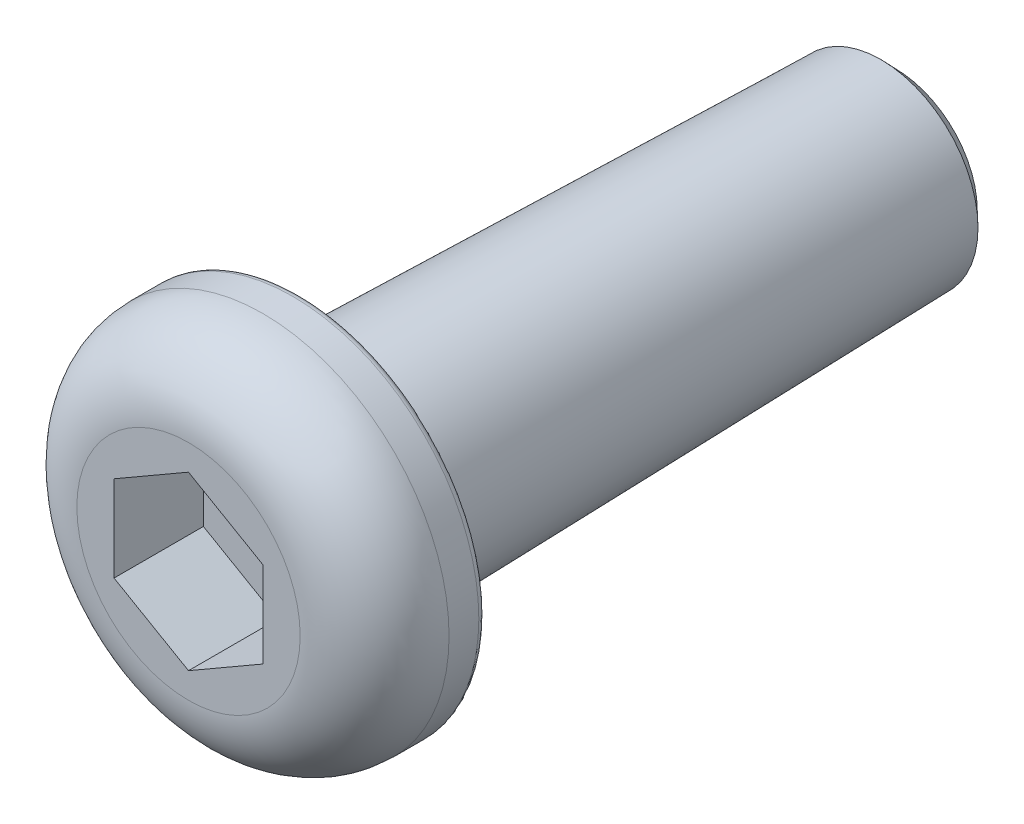
ISO-10303-21;
HEADER;
FILE_DESCRIPTION(('STEP AP214'),'2;1');
FILE_NAME('part.step','',(''),(''),'','','');
FILE_SCHEMA(('AUTOMOTIVE_DESIGN { 1 0 10303 214 1 1 1 1 }'));
ENDSEC;
DATA;
#1=APPLICATION_CONTEXT('core data for automotive mechanical design processes');
#2=APPLICATION_PROTOCOL_DEFINITION('international standard','automotive_design',2000,#1);
#3=PRODUCT_CONTEXT('',#1,'mechanical');
#4=PRODUCT('Part','Part','',(#3));
#5=PRODUCT_RELATED_PRODUCT_CATEGORY('part','',(#4));
#6=PRODUCT_DEFINITION_FORMATION('','',#4);
#7=PRODUCT_DEFINITION_CONTEXT('part definition',#1,'design');
#8=PRODUCT_DEFINITION('design','',#6,#7);
#9=PRODUCT_DEFINITION_SHAPE('','',#8);
#10=(LENGTH_UNIT() NAMED_UNIT(*) SI_UNIT(.MILLI.,.METRE.));
#11=(NAMED_UNIT(*) PLANE_ANGLE_UNIT() SI_UNIT($,.RADIAN.));
#12=(NAMED_UNIT(*) SI_UNIT($,.STERADIAN.) SOLID_ANGLE_UNIT());
#13=UNCERTAINTY_MEASURE_WITH_UNIT(LENGTH_MEASURE(1.E-05),#10,'distance_accuracy_value','');
#14=(GEOMETRIC_REPRESENTATION_CONTEXT(3) GLOBAL_UNCERTAINTY_ASSIGNED_CONTEXT((#13)) GLOBAL_UNIT_ASSIGNED_CONTEXT((#10,
#11,#12)) REPRESENTATION_CONTEXT('',''));
#15=CARTESIAN_POINT('',(0.,0.,0.));
#16=DIRECTION('',(0.,0.,1.));
#17=DIRECTION('',(1.,0.,0.));
#18=AXIS2_PLACEMENT_3D('',#15,#16,#17);
#19=CARTESIAN_POINT('',(0.,0.,8.3));
#20=DIRECTION('',(0.,0.,1.));
#21=DIRECTION('',(1.,0.,0.));
#22=AXIS2_PLACEMENT_3D('',#19,#20,#21);
#23=PLANE('',#22);
#24=DIRECTION('',(0.866025403784439,0.5,0.));
#25=VECTOR('',#24,1.);
#26=CARTESIAN_POINT('',(0.,-1.15470053837925,8.3));
#27=LINE('',#26,#25);
#28=CARTESIAN_POINT('',(0.,-1.15470053837925,8.3));
#29=VERTEX_POINT('',#28);
#30=CARTESIAN_POINT('',(1.,-0.577350269189626,8.3));
#31=VERTEX_POINT('',#30);
#32=EDGE_CURVE('E97',#29,#31,#27,.T.);
#33=ORIENTED_EDGE('',*,*,#32,.T.);
#34=DIRECTION('',(0.,1.,0.));
#35=VECTOR('',#34,1.);
#36=CARTESIAN_POINT('',(1.,-0.577350269189626,8.3));
#37=LINE('',#36,#35);
#38=CARTESIAN_POINT('',(1.,0.577350269189626,8.3));
#39=VERTEX_POINT('',#38);
#40=EDGE_CURVE('E100',#31,#39,#37,.T.);
#41=ORIENTED_EDGE('',*,*,#40,.T.);
#42=DIRECTION('',(-0.866025403784439,0.5,0.));
#43=VECTOR('',#42,1.);
#44=CARTESIAN_POINT('',(0.999999999999999,0.577350269189626,8.3));
#45=LINE('',#44,#43);
#46=CARTESIAN_POINT('',(0.,1.15470053837925,8.3));
#47=VERTEX_POINT('',#46);
#48=EDGE_CURVE('E102',#39,#47,#45,.T.);
#49=ORIENTED_EDGE('',*,*,#48,.T.);
#50=DIRECTION('',(-0.866025403784439,-0.5,0.));
#51=VECTOR('',#50,1.);
#52=CARTESIAN_POINT('',(0.,1.15470053837925,8.3));
#53=LINE('',#52,#51);
#54=CARTESIAN_POINT('',(-1.,0.577350269189625,8.3));
#55=VERTEX_POINT('',#54);
#56=EDGE_CURVE('E206',#47,#55,#53,.T.);
#57=ORIENTED_EDGE('',*,*,#56,.T.);
#58=DIRECTION('',(0.,-1.,0.));
#59=VECTOR('',#58,1.);
#60=CARTESIAN_POINT('',(-1.,0.577350269189625,8.3));
#61=LINE('',#60,#59);
#62=CARTESIAN_POINT('',(-1.,-0.577350269189626,8.3));
#63=VERTEX_POINT('',#62);
#64=EDGE_CURVE('E213',#55,#63,#61,.T.);
#65=ORIENTED_EDGE('',*,*,#64,.T.);
#66=DIRECTION('',(0.866025403784439,-0.5,0.));
#67=VECTOR('',#66,1.);
#68=CARTESIAN_POINT('',(-1.,-0.577350269189626,8.3));
#69=LINE('',#68,#67);
#70=EDGE_CURVE('E219',#63,#29,#69,.T.);
#71=ORIENTED_EDGE('',*,*,#70,.T.);
#72=EDGE_LOOP('',(#33,#41,#49,#57,#65,#71));
#73=FACE_BOUND('',#72,.T.);
#74=ADVANCED_FACE('F16',(#73),#23,.T.);
#75=CARTESIAN_POINT('',(0.999999999999999,0.577350269189626,8.3));
#76=DIRECTION('',(0.5,0.866025403784439,0.));
#77=DIRECTION('',(-0.866025403784439,0.5,0.));
#78=AXIS2_PLACEMENT_3D('',#75,#76,#77);
#79=PLANE('',#78);
#80=DIRECTION('',(0.,0.,1.));
#81=VECTOR('',#80,1.);
#82=CARTESIAN_POINT('',(0.,1.15470053837925,8.3));
#83=LINE('',#82,#81);
#84=CARTESIAN_POINT('',(0.,1.15470053837925,9.5));
#85=VERTEX_POINT('',#84);
#86=EDGE_CURVE('E114',#85,#47,#83,.F.);
#87=ORIENTED_EDGE('',*,*,#86,.T.);
#88=ORIENTED_EDGE('',*,*,#48,.F.);
#89=DIRECTION('',(0.,0.,1.));
#90=VECTOR('',#89,1.);
#91=CARTESIAN_POINT('',(0.999999999999999,0.577350269189626,8.3));
#92=LINE('',#91,#90);
#93=CARTESIAN_POINT('',(1.,0.577350269189626,9.5));
#94=VERTEX_POINT('',#93);
#95=EDGE_CURVE('E108',#39,#94,#92,.T.);
#96=ORIENTED_EDGE('',*,*,#95,.T.);
#97=DIRECTION('',(0.866025403784439,-0.5,0.));
#98=VECTOR('',#97,1.);
#99=CARTESIAN_POINT('',(0.,1.15470053837925,9.5));
#100=LINE('',#99,#98);
#101=EDGE_CURVE('E205',#85,#94,#100,.T.);
#102=ORIENTED_EDGE('',*,*,#101,.F.);
#103=EDGE_LOOP('',(#87,#88,#96,#102));
#104=FACE_BOUND('',#103,.T.);
#105=ADVANCED_FACE('F111',(#104),#79,.F.);
#106=CARTESIAN_POINT('',(1.,-0.577350269189626,8.3));
#107=DIRECTION('',(1.,0.,0.));
#108=DIRECTION('',(0.,1.,0.));
#109=AXIS2_PLACEMENT_3D('',#106,#107,#108);
#110=PLANE('',#109);
#111=ORIENTED_EDGE('',*,*,#95,.F.);
#112=ORIENTED_EDGE('',*,*,#40,.F.);
#113=DIRECTION('',(0.,0.,1.));
#114=VECTOR('',#113,1.);
#115=CARTESIAN_POINT('',(1.,-0.577350269189626,8.3));
#116=LINE('',#115,#114);
#117=CARTESIAN_POINT('',(1.,-0.577350269189626,9.5));
#118=VERTEX_POINT('',#117);
#119=EDGE_CURVE('E127',#31,#118,#116,.T.);
#120=ORIENTED_EDGE('',*,*,#119,.T.);
#121=DIRECTION('',(0.,1.,0.));
#122=VECTOR('',#121,1.);
#123=CARTESIAN_POINT('',(0.999999999999999,0.,9.5));
#124=LINE('',#123,#122);
#125=EDGE_CURVE('E120',#94,#118,#124,.F.);
#126=ORIENTED_EDGE('',*,*,#125,.F.);
#127=EDGE_LOOP('',(#111,#112,#120,#126));
#128=FACE_BOUND('',#127,.T.);
#129=ADVANCED_FACE('F118',(#128),#110,.F.);
#130=CARTESIAN_POINT('',(0.,-1.15470053837925,8.3));
#131=DIRECTION('',(0.5,-0.866025403784439,0.));
#132=DIRECTION('',(0.866025403784439,0.5,0.));
#133=AXIS2_PLACEMENT_3D('',#130,#131,#132);
#134=PLANE('',#133);
#135=ORIENTED_EDGE('',*,*,#119,.F.);
#136=ORIENTED_EDGE('',*,*,#32,.F.);
#137=DIRECTION('',(0.,0.,1.));
#138=VECTOR('',#137,1.);
#139=CARTESIAN_POINT('',(0.,-1.15470053837925,8.3));
#140=LINE('',#139,#138);
#141=CARTESIAN_POINT('',(0.,-1.15470053837925,9.5));
#142=VERTEX_POINT('',#141);
#143=EDGE_CURVE('E216',#29,#142,#140,.T.);
#144=ORIENTED_EDGE('',*,*,#143,.T.);
#145=DIRECTION('',(-0.866025403784439,-0.5,0.));
#146=VECTOR('',#145,1.);
#147=CARTESIAN_POINT('',(1.,-0.577350269189626,9.5));
#148=LINE('',#147,#146);
#149=EDGE_CURVE('E226',#118,#142,#148,.T.);
#150=ORIENTED_EDGE('',*,*,#149,.F.);
#151=EDGE_LOOP('',(#135,#136,#144,#150));
#152=FACE_BOUND('',#151,.T.);
#153=ADVANCED_FACE('F227',(#152),#134,.F.);
#154=CARTESIAN_POINT('',(-1.,-0.577350269189626,8.3));
#155=DIRECTION('',(-0.5,-0.866025403784439,0.));
#156=DIRECTION('',(0.866025403784439,-0.5,0.));
#157=AXIS2_PLACEMENT_3D('',#154,#155,#156);
#158=PLANE('',#157);
#159=ORIENTED_EDGE('',*,*,#143,.F.);
#160=ORIENTED_EDGE('',*,*,#70,.F.);
#161=DIRECTION('',(0.,0.,1.));
#162=VECTOR('',#161,1.);
#163=CARTESIAN_POINT('',(-1.,-0.577350269189626,8.3));
#164=LINE('',#163,#162);
#165=CARTESIAN_POINT('',(-1.,-0.577350269189626,9.5));
#166=VERTEX_POINT('',#165);
#167=EDGE_CURVE('E210',#63,#166,#164,.T.);
#168=ORIENTED_EDGE('',*,*,#167,.T.);
#169=DIRECTION('',(-0.866025403784439,0.5,0.));
#170=VECTOR('',#169,1.);
#171=CARTESIAN_POINT('',(0.,-1.15470053837925,9.5));
#172=LINE('',#171,#170);
#173=EDGE_CURVE('E233',#142,#166,#172,.T.);
#174=ORIENTED_EDGE('',*,*,#173,.F.);
#175=EDGE_LOOP('',(#159,#160,#168,#174));
#176=FACE_BOUND('',#175,.T.);
#177=ADVANCED_FACE('F339',(#176),#158,.F.);
#178=CARTESIAN_POINT('',(-1.,0.577350269189625,8.3));
#179=DIRECTION('',(-1.,0.,0.));
#180=DIRECTION('',(0.,-1.,0.));
#181=AXIS2_PLACEMENT_3D('',#178,#179,#180);
#182=PLANE('',#181);
#183=ORIENTED_EDGE('',*,*,#167,.F.);
#184=ORIENTED_EDGE('',*,*,#64,.F.);
#185=DIRECTION('',(0.,0.,1.));
#186=VECTOR('',#185,1.);
#187=CARTESIAN_POINT('',(-1.,0.577350269189626,8.3));
#188=LINE('',#187,#186);
#189=CARTESIAN_POINT('',(-1.,0.577350269189625,9.5));
#190=VERTEX_POINT('',#189);
#191=EDGE_CURVE('E197',#55,#190,#188,.T.);
#192=ORIENTED_EDGE('',*,*,#191,.T.);
#193=DIRECTION('',(0.,1.,0.));
#194=VECTOR('',#193,1.);
#195=CARTESIAN_POINT('',(-1.,0.,9.5));
#196=LINE('',#195,#194);
#197=EDGE_CURVE('E244',#166,#190,#196,.T.);
#198=ORIENTED_EDGE('',*,*,#197,.F.);
#199=EDGE_LOOP('',(#183,#184,#192,#198));
#200=FACE_BOUND('',#199,.T.);
#201=ADVANCED_FACE('F278',(#200),#182,.F.);
#202=CARTESIAN_POINT('',(0.,1.15470053837925,8.3));
#203=DIRECTION('',(-0.5,0.866025403784439,0.));
#204=DIRECTION('',(-0.866025403784439,-0.5,0.));
#205=AXIS2_PLACEMENT_3D('',#202,#203,#204);
#206=PLANE('',#205);
#207=ORIENTED_EDGE('',*,*,#191,.F.);
#208=ORIENTED_EDGE('',*,*,#56,.F.);
#209=ORIENTED_EDGE('',*,*,#86,.F.);
#210=DIRECTION('',(0.866025403784438,0.5,0.));
#211=VECTOR('',#210,1.);
#212=CARTESIAN_POINT('',(-1.,0.577350269189625,9.5));
#213=LINE('',#212,#211);
#214=EDGE_CURVE('E247',#190,#85,#213,.T.);
#215=ORIENTED_EDGE('',*,*,#214,.F.);
#216=EDGE_LOOP('',(#207,#208,#209,#215));
#217=FACE_BOUND('',#216,.T.);
#218=ADVANCED_FACE('F272',(#217),#206,.F.);
#219=CARTESIAN_POINT('',(0.,0.,9.5));
#220=DIRECTION('',(0.,0.,1.));
#221=DIRECTION('',(1.,0.,0.));
#222=AXIS2_PLACEMENT_3D('',#219,#220,#221);
#223=PLANE('',#222);
#224=ORIENTED_EDGE('',*,*,#197,.T.);
#225=ORIENTED_EDGE('',*,*,#214,.T.);
#226=ORIENTED_EDGE('',*,*,#101,.T.);
#227=ORIENTED_EDGE('',*,*,#125,.T.);
#228=ORIENTED_EDGE('',*,*,#149,.T.);
#229=ORIENTED_EDGE('',*,*,#173,.T.);
#230=EDGE_LOOP('',(#224,#225,#226,#227,#228,#229));
#231=FACE_BOUND('',#230,.T.);
#232=CARTESIAN_POINT('',(0.,0.,9.5));
#233=DIRECTION('',(0.,0.,-1.));
#234=DIRECTION('',(-1.,0.,0.));
#235=AXIS2_PLACEMENT_3D('',#232,#233,#234);
#236=CIRCLE('',#235,1.5);
#237=CARTESIAN_POINT('',(-1.5,0.,9.5));
#238=VERTEX_POINT('',#237);
#239=CARTESIAN_POINT('',(1.5,0.,9.5));
#240=VERTEX_POINT('',#239);
#241=EDGE_CURVE('E250',#238,#240,#236,.T.);
#242=ORIENTED_EDGE('',*,*,#241,.F.);
#243=CARTESIAN_POINT('',(0.,0.,9.5));
#244=DIRECTION('',(0.,0.,-1.));
#245=DIRECTION('',(1.,0.,0.));
#246=AXIS2_PLACEMENT_3D('',#243,#244,#245);
#247=CIRCLE('',#246,1.5);
#248=EDGE_CURVE('E176',#240,#238,#247,.T.);
#249=ORIENTED_EDGE('',*,*,#248,.F.);
#250=EDGE_LOOP('',(#242,#249));
#251=FACE_BOUND('',#250,.T.);
#252=ADVANCED_FACE('F185',(#231,#251),#223,.T.);
#253=CARTESIAN_POINT('',(0.,0.,8.5));
#254=DIRECTION('',(0.,0.,1.));
#255=DIRECTION('',(1.,0.,0.));
#256=AXIS2_PLACEMENT_3D('',#253,#254,#255);
#257=TOROIDAL_SURFACE('',#256,1.5,1.);
#258=CARTESIAN_POINT('',(0.,0.,8.5));
#259=DIRECTION('',(0.,0.,-1.));
#260=DIRECTION('',(-1.,0.,0.));
#261=AXIS2_PLACEMENT_3D('',#258,#259,#260);
#262=CIRCLE('',#261,2.5);
#263=CARTESIAN_POINT('',(-2.5,0.,8.5));
#264=VERTEX_POINT('',#263);
#265=EDGE_CURVE('E172',#264,#264,#262,.T.);
#266=ORIENTED_EDGE('',*,*,#265,.F.);
#267=EDGE_LOOP('',(#266));
#268=FACE_BOUND('',#267,.T.);
#269=ORIENTED_EDGE('',*,*,#248,.T.);
#270=ORIENTED_EDGE('',*,*,#241,.T.);
#271=EDGE_LOOP('',(#269,#270));
#272=FACE_BOUND('',#271,.T.);
#273=ADVANCED_FACE('F180',(#268,#272),#257,.T.);
#274=CARTESIAN_POINT('',(0.,0.,9.5));
#275=DIRECTION('',(0.,0.,-1.));
#276=DIRECTION('',(-1.,0.,0.));
#277=AXIS2_PLACEMENT_3D('',#274,#275,#276);
#278=CYLINDRICAL_SURFACE('',#277,2.5);
#279=ORIENTED_EDGE('',*,*,#265,.T.);
#280=EDGE_LOOP('',(#279));
#281=FACE_BOUND('',#280,.T.);
#282=CARTESIAN_POINT('',(0.,0.,8.1));
#283=DIRECTION('',(0.,0.,1.));
#284=DIRECTION('',(1.,0.,0.));
#285=AXIS2_PLACEMENT_3D('',#282,#283,#284);
#286=CIRCLE('',#285,2.5);
#287=CARTESIAN_POINT('',(2.5,0.,8.1));
#288=VERTEX_POINT('',#287);
#289=EDGE_CURVE('E134',#288,#288,#286,.F.);
#290=ORIENTED_EDGE('',*,*,#289,.F.);
#291=EDGE_LOOP('',(#290));
#292=FACE_BOUND('',#291,.T.);
#293=ADVANCED_FACE('F184',(#281,#292),#278,.T.);
#294=CARTESIAN_POINT('',(0.,0.,0.));
#295=DIRECTION('',(0.,0.,1.));
#296=DIRECTION('',(1.,0.,0.));
#297=AXIS2_PLACEMENT_3D('',#294,#295,#296);
#298=PLANE('',#297);
#299=CARTESIAN_POINT('',(0.,0.,-2.77287416118599E-12));
#300=DIRECTION('',(0.,0.,1.));
#301=DIRECTION('',(1.,0.,0.));
#302=AXIS2_PLACEMENT_3D('',#299,#300,#301);
#303=CIRCLE('',#302,1.09480770231585);
#304=CARTESIAN_POINT('',(1.09480770231585,0.,-2.77287416118599E-12));
#305=VERTEX_POINT('',#304);
#306=EDGE_CURVE('E131',#305,#305,#303,.T.);
#307=ORIENTED_EDGE('',*,*,#306,.F.);
#308=EDGE_LOOP('',(#307));
#309=FACE_BOUND('',#308,.T.);
#310=ADVANCED_FACE('F151',(#309),#298,.F.);
#311=CARTESIAN_POINT('',(0.,0.,8.1));
#312=DIRECTION('',(0.,0.,1.));
#313=DIRECTION('',(1.,0.,0.));
#314=AXIS2_PLACEMENT_3D('',#311,#312,#313);
#315=TOROIDAL_SURFACE('',#314,2.4,0.1);
#316=CARTESIAN_POINT('',(0.,0.,8.));
#317=DIRECTION('',(0.,0.,1.));
#318=DIRECTION('',(1.,0.,0.));
#319=AXIS2_PLACEMENT_3D('',#316,#317,#318);
#320=CIRCLE('',#319,2.4);
#321=CARTESIAN_POINT('',(2.4,0.,8.));
#322=VERTEX_POINT('',#321);
#323=CARTESIAN_POINT('',(-2.4,0.,8.));
#324=VERTEX_POINT('',#323);
#325=EDGE_CURVE('E39',#322,#324,#320,.T.);
#326=ORIENTED_EDGE('',*,*,#325,.T.);
#327=CARTESIAN_POINT('',(0.,0.,8.));
#328=DIRECTION('',(0.,0.,1.));
#329=DIRECTION('',(-1.,0.,0.));
#330=AXIS2_PLACEMENT_3D('',#327,#328,#329);
#331=CIRCLE('',#330,2.4);
#332=EDGE_CURVE('E160',#324,#322,#331,.T.);
#333=ORIENTED_EDGE('',*,*,#332,.T.);
#334=EDGE_LOOP('',(#326,#333));
#335=FACE_BOUND('',#334,.T.);
#336=ORIENTED_EDGE('',*,*,#289,.T.);
#337=EDGE_LOOP('',(#336));
#338=FACE_BOUND('',#337,.T.);
#339=ADVANCED_FACE('F139',(#335,#338),#315,.T.);
#340=CARTESIAN_POINT('',(0.,0.,0.199937529316685));
#341=DIRECTION('',(0.,0.,1.));
#342=DIRECTION('',(1.,0.,0.));
#343=AXIS2_PLACEMENT_3D('',#340,#341,#342);
#344=CONICAL_SURFACE('',#343,1.30499843828602,0.810392957061385);
#345=CARTESIAN_POINT('',(0.,0.,0.199937529259842));
#346=DIRECTION('',(0.,0.,1.));
#347=DIRECTION('',(1.,0.,0.));
#348=AXIS2_PLACEMENT_3D('',#345,#346,#347);
#349=CIRCLE('',#348,1.30499843823095);
#350=CARTESIAN_POINT('',(1.30499843823095,0.,0.199937529259842));
#351=VERTEX_POINT('',#350);
#352=EDGE_CURVE('E28',#351,#351,#349,.T.);
#353=ORIENTED_EDGE('',*,*,#352,.F.);
#354=EDGE_LOOP('',(#353));
#355=FACE_BOUND('',#354,.T.);
#356=ORIENTED_EDGE('',*,*,#306,.T.);
#357=EDGE_LOOP('',(#356));
#358=FACE_BOUND('',#357,.T.);
#359=ADVANCED_FACE('F150',(#355,#358),#344,.T.);
#360=CARTESIAN_POINT('',(0.,0.,8.));
#361=DIRECTION('',(0.,0.,1.));
#362=DIRECTION('',(1.,0.,0.));
#363=AXIS2_PLACEMENT_3D('',#360,#361,#362);
#364=PLANE('',#363);
#365=CARTESIAN_POINT('',(0.,0.,7.99999999998136));
#366=DIRECTION('',(0.,0.,1.));
#367=DIRECTION('',(1.,0.,0.));
#368=AXIS2_PLACEMENT_3D('',#365,#366,#367);
#369=CIRCLE('',#368,1.49999999999899);
#370=CARTESIAN_POINT('',(1.49999999999899,0.,7.99999999998136));
#371=VERTEX_POINT('',#370);
#372=EDGE_CURVE('E11',#371,#371,#369,.F.);
#373=ORIENTED_EDGE('',*,*,#372,.F.);
#374=EDGE_LOOP('',(#373));
#375=FACE_BOUND('',#374,.T.);
#376=ORIENTED_EDGE('',*,*,#325,.F.);
#377=ORIENTED_EDGE('',*,*,#332,.F.);
#378=EDGE_LOOP('',(#376,#377));
#379=FACE_BOUND('',#378,.T.);
#380=ADVANCED_FACE('F282',(#375,#379),#364,.F.);
#381=CARTESIAN_POINT('',(0.,0.,7.99999999981083));
#382=DIRECTION('',(0.,0.,1.));
#383=DIRECTION('',(1.,0.,0.));
#384=AXIS2_PLACEMENT_3D('',#381,#382,#383);
#385=CONICAL_SURFACE('',#384,1.49999999999473,0.0249947936188291);
#386=ORIENTED_EDGE('',*,*,#372,.T.);
#387=EDGE_LOOP('',(#386));
#388=FACE_BOUND('',#387,.T.);
#389=ORIENTED_EDGE('',*,*,#352,.T.);
#390=EDGE_LOOP('',(#389));
#391=FACE_BOUND('',#390,.T.);
#392=ADVANCED_FACE('F280',(#388,#391),#385,.T.);
#393=CLOSED_SHELL('',(#74,#105,#129,#153,#177,#201,#218,#252,#273,#293,#310,#339,#359,#380,#392));
#394=MANIFOLD_SOLID_BREP('B1',#393);
#395=ADVANCED_BREP_SHAPE_REPRESENTATION('',(#18,#394),#14);
#396=SHAPE_DEFINITION_REPRESENTATION(#9,#395);
ENDSEC;
END-ISO-10303-21;
